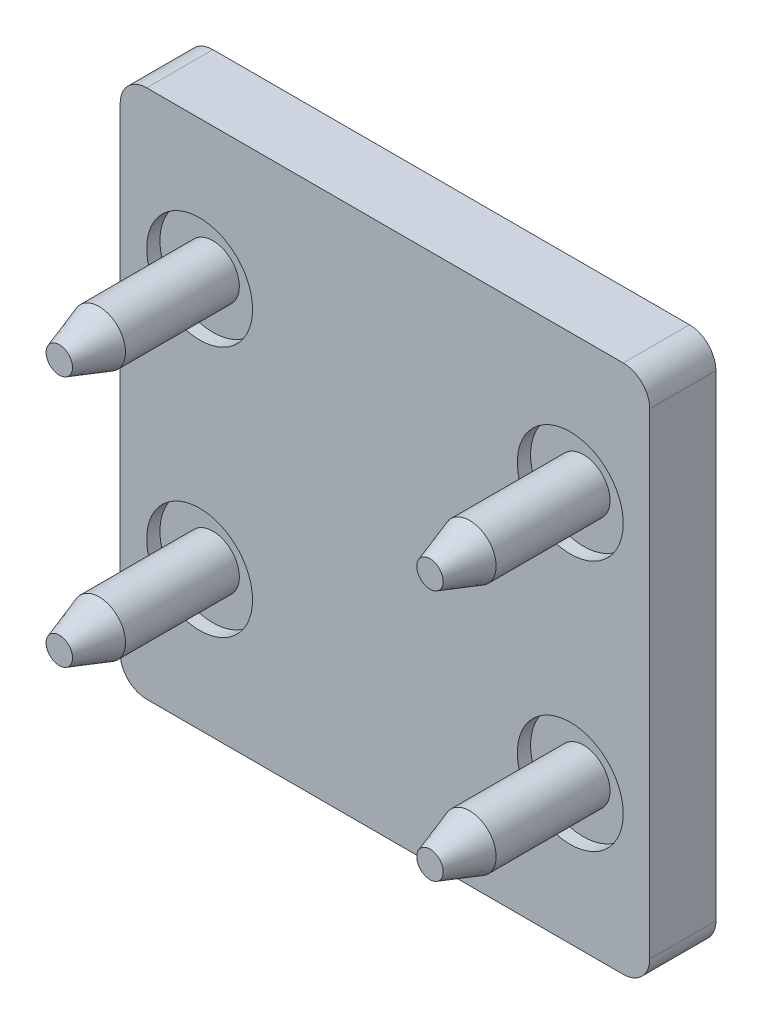
ISO-10303-21;
HEADER;
FILE_DESCRIPTION(('STEP AP214'),'2;1');
FILE_NAME('part.step','',(''),(''),'','','');
FILE_SCHEMA(('AUTOMOTIVE_DESIGN { 1 0 10303 214 1 1 1 1 }'));
ENDSEC;
DATA;
#1=APPLICATION_CONTEXT('core data for automotive mechanical design processes');
#2=APPLICATION_PROTOCOL_DEFINITION('international standard','automotive_design',2000,#1);
#3=PRODUCT_CONTEXT('',#1,'mechanical');
#4=PRODUCT('Part','Part','',(#3));
#5=PRODUCT_RELATED_PRODUCT_CATEGORY('part','',(#4));
#6=PRODUCT_DEFINITION_FORMATION('','',#4);
#7=PRODUCT_DEFINITION_CONTEXT('part definition',#1,'design');
#8=PRODUCT_DEFINITION('design','',#6,#7);
#9=PRODUCT_DEFINITION_SHAPE('','',#8);
#10=(LENGTH_UNIT() NAMED_UNIT(*) SI_UNIT(.MILLI.,.METRE.));
#11=(NAMED_UNIT(*) PLANE_ANGLE_UNIT() SI_UNIT($,.RADIAN.));
#12=(NAMED_UNIT(*) SI_UNIT($,.STERADIAN.) SOLID_ANGLE_UNIT());
#13=UNCERTAINTY_MEASURE_WITH_UNIT(LENGTH_MEASURE(1.E-05),#10,'distance_accuracy_value','');
#14=(GEOMETRIC_REPRESENTATION_CONTEXT(3) GLOBAL_UNCERTAINTY_ASSIGNED_CONTEXT((#13)) GLOBAL_UNIT_ASSIGNED_CONTEXT((#10,
#11,#12)) REPRESENTATION_CONTEXT('',''));
#15=CARTESIAN_POINT('',(0.,0.,0.));
#16=DIRECTION('',(0.,0.,1.));
#17=DIRECTION('',(1.,0.,0.));
#18=AXIS2_PLACEMENT_3D('',#15,#16,#17);
#19=CARTESIAN_POINT('',(-7.,-2.75,-0.5));
#20=DIRECTION('',(0.,0.,1.));
#21=DIRECTION('',(1.,0.,0.));
#22=AXIS2_PLACEMENT_3D('',#19,#20,#21);
#23=PLANE('',#22);
#24=CARTESIAN_POINT('',(-7.,-4.75,-0.5));
#25=DIRECTION('',(0.,0.,1.));
#26=DIRECTION('',(1.,0.,0.));
#27=AXIS2_PLACEMENT_3D('',#24,#25,#26);
#28=CIRCLE('',#27,2.);
#29=CARTESIAN_POINT('',(-5.,-4.75,-0.5));
#30=VERTEX_POINT('',#29);
#31=EDGE_CURVE('E516',#30,#30,#28,.T.);
#32=ORIENTED_EDGE('',*,*,#31,.T.);
#33=EDGE_LOOP('',(#32));
#34=FACE_BOUND('',#33,.T.);
#35=CARTESIAN_POINT('',(-7.,-4.75,-0.5));
#36=DIRECTION('',(0.,0.,1.));
#37=DIRECTION('',(1.,0.,0.));
#38=AXIS2_PLACEMENT_3D('',#35,#36,#37);
#39=CIRCLE('',#38,1.);
#40=CARTESIAN_POINT('',(-6.,-4.75,-0.5));
#41=VERTEX_POINT('',#40);
#42=EDGE_CURVE('E482',#41,#41,#39,.T.);
#43=ORIENTED_EDGE('',*,*,#42,.F.);
#44=EDGE_LOOP('',(#43));
#45=FACE_BOUND('',#44,.T.);
#46=ADVANCED_FACE('F34',(#34,#45),#23,.T.);
#47=CARTESIAN_POINT('',(7.,-2.75,-0.5));
#48=DIRECTION('',(0.,0.,1.));
#49=DIRECTION('',(1.,0.,0.));
#50=AXIS2_PLACEMENT_3D('',#47,#48,#49);
#51=PLANE('',#50);
#52=CARTESIAN_POINT('',(7.,-4.75,-0.5));
#53=DIRECTION('',(0.,0.,1.));
#54=DIRECTION('',(1.,0.,0.));
#55=AXIS2_PLACEMENT_3D('',#52,#53,#54);
#56=CIRCLE('',#55,2.);
#57=CARTESIAN_POINT('',(9.,-4.75,-0.5));
#58=VERTEX_POINT('',#57);
#59=EDGE_CURVE('E521',#58,#58,#56,.T.);
#60=ORIENTED_EDGE('',*,*,#59,.T.);
#61=EDGE_LOOP('',(#60));
#62=FACE_BOUND('',#61,.T.);
#63=CARTESIAN_POINT('',(7.,-4.75,-0.5));
#64=DIRECTION('',(0.,0.,1.));
#65=DIRECTION('',(1.,0.,0.));
#66=AXIS2_PLACEMENT_3D('',#63,#64,#65);
#67=CIRCLE('',#66,1.);
#68=CARTESIAN_POINT('',(8.,-4.75,-0.5));
#69=VERTEX_POINT('',#68);
#70=EDGE_CURVE('E489',#69,#69,#67,.T.);
#71=ORIENTED_EDGE('',*,*,#70,.F.);
#72=EDGE_LOOP('',(#71));
#73=FACE_BOUND('',#72,.T.);
#74=ADVANCED_FACE('F176',(#62,#73),#51,.T.);
#75=CARTESIAN_POINT('',(7.,6.75,-0.5));
#76=DIRECTION('',(0.,0.,1.));
#77=DIRECTION('',(1.,0.,0.));
#78=AXIS2_PLACEMENT_3D('',#75,#76,#77);
#79=PLANE('',#78);
#80=CARTESIAN_POINT('',(7.,4.75,-0.5));
#81=DIRECTION('',(0.,0.,1.));
#82=DIRECTION('',(1.,0.,0.));
#83=AXIS2_PLACEMENT_3D('',#80,#81,#82);
#84=CIRCLE('',#83,2.);
#85=CARTESIAN_POINT('',(9.,4.75,-0.5));
#86=VERTEX_POINT('',#85);
#87=EDGE_CURVE('E525',#86,#86,#84,.T.);
#88=ORIENTED_EDGE('',*,*,#87,.T.);
#89=EDGE_LOOP('',(#88));
#90=FACE_BOUND('',#89,.T.);
#91=CARTESIAN_POINT('',(7.,4.75,-0.5));
#92=DIRECTION('',(0.,0.,1.));
#93=DIRECTION('',(1.,0.,0.));
#94=AXIS2_PLACEMENT_3D('',#91,#92,#93);
#95=CIRCLE('',#94,1.);
#96=CARTESIAN_POINT('',(8.,4.75,-0.5));
#97=VERTEX_POINT('',#96);
#98=EDGE_CURVE('E498',#97,#97,#95,.T.);
#99=ORIENTED_EDGE('',*,*,#98,.F.);
#100=EDGE_LOOP('',(#99));
#101=FACE_BOUND('',#100,.T.);
#102=ADVANCED_FACE('F182',(#90,#101),#79,.T.);
#103=CARTESIAN_POINT('',(-7.,6.75,-0.5));
#104=DIRECTION('',(0.,0.,1.));
#105=DIRECTION('',(1.,0.,0.));
#106=AXIS2_PLACEMENT_3D('',#103,#104,#105);
#107=PLANE('',#106);
#108=CARTESIAN_POINT('',(-7.,4.75,-0.5));
#109=DIRECTION('',(0.,0.,1.));
#110=DIRECTION('',(1.,0.,0.));
#111=AXIS2_PLACEMENT_3D('',#108,#109,#110);
#112=CIRCLE('',#111,2.);
#113=CARTESIAN_POINT('',(-5.,4.75,-0.5));
#114=VERTEX_POINT('',#113);
#115=EDGE_CURVE('E225',#114,#114,#112,.T.);
#116=ORIENTED_EDGE('',*,*,#115,.T.);
#117=EDGE_LOOP('',(#116));
#118=FACE_BOUND('',#117,.T.);
#119=CARTESIAN_POINT('',(-7.,4.75,-0.5));
#120=DIRECTION('',(0.,0.,1.));
#121=DIRECTION('',(1.,0.,0.));
#122=AXIS2_PLACEMENT_3D('',#119,#120,#121);
#123=CIRCLE('',#122,1.);
#124=CARTESIAN_POINT('',(-6.,4.75,-0.5));
#125=VERTEX_POINT('',#124);
#126=EDGE_CURVE('E507',#125,#125,#123,.T.);
#127=ORIENTED_EDGE('',*,*,#126,.F.);
#128=EDGE_LOOP('',(#127));
#129=FACE_BOUND('',#128,.T.);
#130=ADVANCED_FACE('F202',(#118,#129),#107,.T.);
#131=CARTESIAN_POINT('',(-8.99999999999983,8.99999999999983,0.));
#132=DIRECTION('',(0.,0.,1.));
#133=DIRECTION('',(1.,0.,0.));
#134=AXIS2_PLACEMENT_3D('',#131,#132,#133);
#135=PLANE('',#134);
#136=CARTESIAN_POINT('',(7.,-4.75,0.));
#137=DIRECTION('',(0.,0.,1.));
#138=DIRECTION('',(1.,0.,0.));
#139=AXIS2_PLACEMENT_3D('',#136,#137,#138);
#140=CIRCLE('',#139,2.);
#141=CARTESIAN_POINT('',(9.,-4.75,0.));
#142=VERTEX_POINT('',#141);
#143=EDGE_CURVE('E222',#142,#142,#140,.T.);
#144=ORIENTED_EDGE('',*,*,#143,.F.);
#145=EDGE_LOOP('',(#144));
#146=FACE_BOUND('',#145,.T.);
#147=CARTESIAN_POINT('',(-7.,4.75,0.));
#148=DIRECTION('',(0.,0.,1.));
#149=DIRECTION('',(1.,0.,0.));
#150=AXIS2_PLACEMENT_3D('',#147,#148,#149);
#151=CIRCLE('',#150,2.);
#152=CARTESIAN_POINT('',(-5.,4.75,0.));
#153=VERTEX_POINT('',#152);
#154=EDGE_CURVE('E136',#153,#153,#151,.T.);
#155=ORIENTED_EDGE('',*,*,#154,.F.);
#156=EDGE_LOOP('',(#155));
#157=FACE_BOUND('',#156,.T.);
#158=CARTESIAN_POINT('',(-8.99999999999983,8.99999999999983,0.));
#159=DIRECTION('',(0.,0.,1.));
#160=DIRECTION('',(1.,0.,0.));
#161=AXIS2_PLACEMENT_3D('',#158,#159,#160);
#162=CIRCLE('',#161,1.00000000000017);
#163=CARTESIAN_POINT('',(-9.,10.,0.));
#164=VERTEX_POINT('',#163);
#165=CARTESIAN_POINT('',(-10.,9.,0.));
#166=VERTEX_POINT('',#165);
#167=EDGE_CURVE('E132',#164,#166,#162,.T.);
#168=ORIENTED_EDGE('',*,*,#167,.T.);
#169=DIRECTION('',(0.,-1.,0.));
#170=VECTOR('',#169,1.);
#171=CARTESIAN_POINT('',(-10.,9.,0.));
#172=LINE('',#171,#170);
#173=CARTESIAN_POINT('',(-10.,-9.,0.));
#174=VERTEX_POINT('',#173);
#175=EDGE_CURVE('E135',#166,#174,#172,.T.);
#176=ORIENTED_EDGE('',*,*,#175,.T.);
#177=CARTESIAN_POINT('',(-8.99999999999983,-8.99999999999983,0.));
#178=DIRECTION('',(0.,0.,1.));
#179=DIRECTION('',(1.,0.,0.));
#180=AXIS2_PLACEMENT_3D('',#177,#178,#179);
#181=CIRCLE('',#180,1.00000000000017);
#182=CARTESIAN_POINT('',(-9.,-10.,0.));
#183=VERTEX_POINT('',#182);
#184=EDGE_CURVE('E139',#174,#183,#181,.T.);
#185=ORIENTED_EDGE('',*,*,#184,.T.);
#186=DIRECTION('',(1.,0.,0.));
#187=VECTOR('',#186,1.);
#188=CARTESIAN_POINT('',(-9.,-10.,0.));
#189=LINE('',#188,#187);
#190=CARTESIAN_POINT('',(9.,-10.,0.));
#191=VERTEX_POINT('',#190);
#192=EDGE_CURVE('E142',#183,#191,#189,.T.);
#193=ORIENTED_EDGE('',*,*,#192,.T.);
#194=CARTESIAN_POINT('',(8.99999999999983,-8.99999999999983,0.));
#195=DIRECTION('',(0.,0.,1.));
#196=DIRECTION('',(1.,0.,0.));
#197=AXIS2_PLACEMENT_3D('',#194,#195,#196);
#198=CIRCLE('',#197,1.00000000000017);
#199=CARTESIAN_POINT('',(10.,-9.,0.));
#200=VERTEX_POINT('',#199);
#201=EDGE_CURVE('E145',#191,#200,#198,.T.);
#202=ORIENTED_EDGE('',*,*,#201,.T.);
#203=DIRECTION('',(0.,1.,0.));
#204=VECTOR('',#203,1.);
#205=CARTESIAN_POINT('',(10.,-9.,0.));
#206=LINE('',#205,#204);
#207=CARTESIAN_POINT('',(10.,9.,0.));
#208=VERTEX_POINT('',#207);
#209=EDGE_CURVE('E148',#200,#208,#206,.T.);
#210=ORIENTED_EDGE('',*,*,#209,.T.);
#211=CARTESIAN_POINT('',(8.99999999999983,8.99999999999983,0.));
#212=DIRECTION('',(0.,0.,1.));
#213=DIRECTION('',(1.,0.,0.));
#214=AXIS2_PLACEMENT_3D('',#211,#212,#213);
#215=CIRCLE('',#214,1.00000000000017);
#216=CARTESIAN_POINT('',(9.,10.,0.));
#217=VERTEX_POINT('',#216);
#218=EDGE_CURVE('E109',#208,#217,#215,.T.);
#219=ORIENTED_EDGE('',*,*,#218,.T.);
#220=DIRECTION('',(-1.,0.,0.));
#221=VECTOR('',#220,1.);
#222=CARTESIAN_POINT('',(9.,10.,0.));
#223=LINE('',#222,#221);
#224=EDGE_CURVE('E151',#217,#164,#223,.T.);
#225=ORIENTED_EDGE('',*,*,#224,.T.);
#226=EDGE_LOOP('',(#168,#176,#185,#193,#202,#210,#219,#225));
#227=FACE_BOUND('',#226,.T.);
#228=CARTESIAN_POINT('',(7.,4.75,0.));
#229=DIRECTION('',(0.,0.,1.));
#230=DIRECTION('',(1.,0.,0.));
#231=AXIS2_PLACEMENT_3D('',#228,#229,#230);
#232=CIRCLE('',#231,2.);
#233=CARTESIAN_POINT('',(9.,4.75,0.));
#234=VERTEX_POINT('',#233);
#235=EDGE_CURVE('E228',#234,#234,#232,.T.);
#236=ORIENTED_EDGE('',*,*,#235,.F.);
#237=EDGE_LOOP('',(#236));
#238=FACE_BOUND('',#237,.T.);
#239=CARTESIAN_POINT('',(-7.,-4.75,0.));
#240=DIRECTION('',(0.,0.,1.));
#241=DIRECTION('',(1.,0.,0.));
#242=AXIS2_PLACEMENT_3D('',#239,#240,#241);
#243=CIRCLE('',#242,2.);
#244=CARTESIAN_POINT('',(-5.,-4.75,0.));
#245=VERTEX_POINT('',#244);
#246=EDGE_CURVE('E518',#245,#245,#243,.T.);
#247=ORIENTED_EDGE('',*,*,#246,.F.);
#248=EDGE_LOOP('',(#247));
#249=FACE_BOUND('',#248,.T.);
#250=ADVANCED_FACE('F164',(#146,#157,#227,#238,#249),#135,.T.);
#251=CARTESIAN_POINT('',(-8.99999999999983,8.99999999999983,-2.5));
#252=DIRECTION('',(0.,0.,1.));
#253=DIRECTION('',(1.,0.,0.));
#254=AXIS2_PLACEMENT_3D('',#251,#252,#253);
#255=CYLINDRICAL_SURFACE('',#254,1.00000000000017);
#256=ORIENTED_EDGE('',*,*,#167,.F.);
#257=DIRECTION('',(0.,0.,1.));
#258=VECTOR('',#257,1.);
#259=CARTESIAN_POINT('',(-9.,10.,-2.5));
#260=LINE('',#259,#258);
#261=CARTESIAN_POINT('',(-9.,10.,-2.5));
#262=VERTEX_POINT('',#261);
#263=EDGE_CURVE('E11',#262,#164,#260,.T.);
#264=ORIENTED_EDGE('',*,*,#263,.F.);
#265=CARTESIAN_POINT('',(-8.99999999999983,8.99999999999983,-2.5));
#266=DIRECTION('',(0.,0.,1.));
#267=DIRECTION('',(1.,0.,0.));
#268=AXIS2_PLACEMENT_3D('',#265,#266,#267);
#269=CIRCLE('',#268,1.00000000000017);
#270=CARTESIAN_POINT('',(-10.,9.,-2.5));
#271=VERTEX_POINT('',#270);
#272=EDGE_CURVE('E153',#262,#271,#269,.T.);
#273=ORIENTED_EDGE('',*,*,#272,.T.);
#274=DIRECTION('',(0.,0.,1.));
#275=VECTOR('',#274,1.);
#276=CARTESIAN_POINT('',(-10.,9.,-2.5));
#277=LINE('',#276,#275);
#278=EDGE_CURVE('E38',#271,#166,#277,.T.);
#279=ORIENTED_EDGE('',*,*,#278,.T.);
#280=EDGE_LOOP('',(#256,#264,#273,#279));
#281=FACE_BOUND('',#280,.T.);
#282=ADVANCED_FACE('F36',(#281),#255,.T.);
#283=CARTESIAN_POINT('',(9.,10.,-2.5));
#284=DIRECTION('',(0.,1.,0.));
#285=DIRECTION('',(0.,0.,1.));
#286=AXIS2_PLACEMENT_3D('',#283,#284,#285);
#287=PLANE('',#286);
#288=ORIENTED_EDGE('',*,*,#224,.F.);
#289=DIRECTION('',(0.,0.,1.));
#290=VECTOR('',#289,1.);
#291=CARTESIAN_POINT('',(9.,10.,-2.5));
#292=LINE('',#291,#290);
#293=CARTESIAN_POINT('',(9.,10.,-2.5));
#294=VERTEX_POINT('',#293);
#295=EDGE_CURVE('E44',#294,#217,#292,.T.);
#296=ORIENTED_EDGE('',*,*,#295,.F.);
#297=DIRECTION('',(-1.,0.,0.));
#298=VECTOR('',#297,1.);
#299=CARTESIAN_POINT('',(9.,10.,-2.5));
#300=LINE('',#299,#298);
#301=EDGE_CURVE('E122',#294,#262,#300,.T.);
#302=ORIENTED_EDGE('',*,*,#301,.T.);
#303=ORIENTED_EDGE('',*,*,#263,.T.);
#304=EDGE_LOOP('',(#288,#296,#302,#303));
#305=FACE_BOUND('',#304,.T.);
#306=ADVANCED_FACE('F166',(#305),#287,.T.);
#307=CARTESIAN_POINT('',(8.99999999999983,8.99999999999983,-2.5));
#308=DIRECTION('',(0.,0.,1.));
#309=DIRECTION('',(1.,0.,0.));
#310=AXIS2_PLACEMENT_3D('',#307,#308,#309);
#311=CYLINDRICAL_SURFACE('',#310,1.00000000000017);
#312=ORIENTED_EDGE('',*,*,#218,.F.);
#313=DIRECTION('',(0.,0.,1.));
#314=VECTOR('',#313,1.);
#315=CARTESIAN_POINT('',(10.,9.,-2.5));
#316=LINE('',#315,#314);
#317=CARTESIAN_POINT('',(10.,9.,-2.5));
#318=VERTEX_POINT('',#317);
#319=EDGE_CURVE('E104',#318,#208,#316,.T.);
#320=ORIENTED_EDGE('',*,*,#319,.F.);
#321=CARTESIAN_POINT('',(8.99999999999983,8.99999999999983,-2.5));
#322=DIRECTION('',(0.,0.,1.));
#323=DIRECTION('',(1.,0.,0.));
#324=AXIS2_PLACEMENT_3D('',#321,#322,#323);
#325=CIRCLE('',#324,1.00000000000017);
#326=EDGE_CURVE('E107',#318,#294,#325,.T.);
#327=ORIENTED_EDGE('',*,*,#326,.T.);
#328=ORIENTED_EDGE('',*,*,#295,.T.);
#329=EDGE_LOOP('',(#312,#320,#327,#328));
#330=FACE_BOUND('',#329,.T.);
#331=ADVANCED_FACE('F106',(#330),#311,.T.);
#332=CARTESIAN_POINT('',(10.,-9.,-2.5));
#333=DIRECTION('',(1.,0.,0.));
#334=DIRECTION('',(0.,0.,-1.));
#335=AXIS2_PLACEMENT_3D('',#332,#333,#334);
#336=PLANE('',#335);
#337=ORIENTED_EDGE('',*,*,#209,.F.);
#338=DIRECTION('',(0.,0.,1.));
#339=VECTOR('',#338,1.);
#340=CARTESIAN_POINT('',(10.,-9.,-2.5));
#341=LINE('',#340,#339);
#342=CARTESIAN_POINT('',(10.,-9.,-2.5));
#343=VERTEX_POINT('',#342);
#344=EDGE_CURVE('E114',#343,#200,#341,.T.);
#345=ORIENTED_EDGE('',*,*,#344,.F.);
#346=DIRECTION('',(0.,1.,0.));
#347=VECTOR('',#346,1.);
#348=CARTESIAN_POINT('',(10.,-9.,-2.5));
#349=LINE('',#348,#347);
#350=EDGE_CURVE('E120',#343,#318,#349,.T.);
#351=ORIENTED_EDGE('',*,*,#350,.T.);
#352=ORIENTED_EDGE('',*,*,#319,.T.);
#353=EDGE_LOOP('',(#337,#345,#351,#352));
#354=FACE_BOUND('',#353,.T.);
#355=ADVANCED_FACE('F124',(#354),#336,.T.);
#356=CARTESIAN_POINT('',(8.99999999999983,-8.99999999999983,-2.5));
#357=DIRECTION('',(0.,0.,1.));
#358=DIRECTION('',(1.,0.,0.));
#359=AXIS2_PLACEMENT_3D('',#356,#357,#358);
#360=CYLINDRICAL_SURFACE('',#359,1.00000000000017);
#361=ORIENTED_EDGE('',*,*,#201,.F.);
#362=DIRECTION('',(0.,0.,1.));
#363=VECTOR('',#362,1.);
#364=CARTESIAN_POINT('',(9.,-10.,-2.5));
#365=LINE('',#364,#363);
#366=CARTESIAN_POINT('',(9.,-10.,-2.5));
#367=VERTEX_POINT('',#366);
#368=EDGE_CURVE('E157',#367,#191,#365,.T.);
#369=ORIENTED_EDGE('',*,*,#368,.F.);
#370=CARTESIAN_POINT('',(8.99999999999983,-8.99999999999983,-2.5));
#371=DIRECTION('',(0.,0.,1.));
#372=DIRECTION('',(1.,0.,0.));
#373=AXIS2_PLACEMENT_3D('',#370,#371,#372);
#374=CIRCLE('',#373,1.00000000000017);
#375=EDGE_CURVE('E125',#367,#343,#374,.T.);
#376=ORIENTED_EDGE('',*,*,#375,.T.);
#377=ORIENTED_EDGE('',*,*,#344,.T.);
#378=EDGE_LOOP('',(#361,#369,#376,#377));
#379=FACE_BOUND('',#378,.T.);
#380=ADVANCED_FACE('F247',(#379),#360,.T.);
#381=CARTESIAN_POINT('',(-9.,-10.,-2.5));
#382=DIRECTION('',(0.,-1.,0.));
#383=DIRECTION('',(0.,0.,-1.));
#384=AXIS2_PLACEMENT_3D('',#381,#382,#383);
#385=PLANE('',#384);
#386=ORIENTED_EDGE('',*,*,#192,.F.);
#387=DIRECTION('',(0.,0.,1.));
#388=VECTOR('',#387,1.);
#389=CARTESIAN_POINT('',(-9.,-10.,-2.5));
#390=LINE('',#389,#388);
#391=CARTESIAN_POINT('',(-9.,-10.,-2.5));
#392=VERTEX_POINT('',#391);
#393=EDGE_CURVE('E159',#392,#183,#390,.T.);
#394=ORIENTED_EDGE('',*,*,#393,.F.);
#395=DIRECTION('',(1.,0.,0.));
#396=VECTOR('',#395,1.);
#397=CARTESIAN_POINT('',(-9.,-10.,-2.5));
#398=LINE('',#397,#396);
#399=EDGE_CURVE('E127',#392,#367,#398,.T.);
#400=ORIENTED_EDGE('',*,*,#399,.T.);
#401=ORIENTED_EDGE('',*,*,#368,.T.);
#402=EDGE_LOOP('',(#386,#394,#400,#401));
#403=FACE_BOUND('',#402,.T.);
#404=ADVANCED_FACE('F241',(#403),#385,.T.);
#405=CARTESIAN_POINT('',(-8.99999999999983,-8.99999999999983,-2.5));
#406=DIRECTION('',(0.,0.,1.));
#407=DIRECTION('',(1.,0.,0.));
#408=AXIS2_PLACEMENT_3D('',#405,#406,#407);
#409=CYLINDRICAL_SURFACE('',#408,1.00000000000017);
#410=ORIENTED_EDGE('',*,*,#184,.F.);
#411=DIRECTION('',(0.,0.,1.));
#412=VECTOR('',#411,1.);
#413=CARTESIAN_POINT('',(-10.,-9.,-2.5));
#414=LINE('',#413,#412);
#415=CARTESIAN_POINT('',(-10.,-9.,-2.5));
#416=VERTEX_POINT('',#415);
#417=EDGE_CURVE('E160',#416,#174,#414,.T.);
#418=ORIENTED_EDGE('',*,*,#417,.F.);
#419=CARTESIAN_POINT('',(-8.99999999999983,-8.99999999999983,-2.5));
#420=DIRECTION('',(0.,0.,1.));
#421=DIRECTION('',(1.,0.,0.));
#422=AXIS2_PLACEMENT_3D('',#419,#420,#421);
#423=CIRCLE('',#422,1.00000000000017);
#424=EDGE_CURVE('E235',#416,#392,#423,.T.);
#425=ORIENTED_EDGE('',*,*,#424,.T.);
#426=ORIENTED_EDGE('',*,*,#393,.T.);
#427=EDGE_LOOP('',(#410,#418,#425,#426));
#428=FACE_BOUND('',#427,.T.);
#429=ADVANCED_FACE('F245',(#428),#409,.T.);
#430=CARTESIAN_POINT('',(-10.,9.,-2.5));
#431=DIRECTION('',(-1.,0.,0.));
#432=DIRECTION('',(0.,0.,1.));
#433=AXIS2_PLACEMENT_3D('',#430,#431,#432);
#434=PLANE('',#433);
#435=ORIENTED_EDGE('',*,*,#175,.F.);
#436=ORIENTED_EDGE('',*,*,#278,.F.);
#437=DIRECTION('',(0.,-1.,0.));
#438=VECTOR('',#437,1.);
#439=CARTESIAN_POINT('',(-10.,9.,-2.5));
#440=LINE('',#439,#438);
#441=EDGE_CURVE('E233',#271,#416,#440,.T.);
#442=ORIENTED_EDGE('',*,*,#441,.T.);
#443=ORIENTED_EDGE('',*,*,#417,.T.);
#444=EDGE_LOOP('',(#435,#436,#442,#443));
#445=FACE_BOUND('',#444,.T.);
#446=ADVANCED_FACE('F162',(#445),#434,.T.);
#447=CARTESIAN_POINT('',(-8.99999999999983,8.99999999999983,-2.5));
#448=DIRECTION('',(0.,0.,1.));
#449=DIRECTION('',(1.,0.,0.));
#450=AXIS2_PLACEMENT_3D('',#447,#448,#449);
#451=PLANE('',#450);
#452=ORIENTED_EDGE('',*,*,#272,.F.);
#453=ORIENTED_EDGE('',*,*,#301,.F.);
#454=ORIENTED_EDGE('',*,*,#326,.F.);
#455=ORIENTED_EDGE('',*,*,#350,.F.);
#456=ORIENTED_EDGE('',*,*,#375,.F.);
#457=ORIENTED_EDGE('',*,*,#399,.F.);
#458=ORIENTED_EDGE('',*,*,#424,.F.);
#459=ORIENTED_EDGE('',*,*,#441,.F.);
#460=EDGE_LOOP('',(#452,#453,#454,#455,#456,#457,#458,#459));
#461=FACE_BOUND('',#460,.T.);
#462=ADVANCED_FACE('F118',(#461),#451,.F.);
#463=CARTESIAN_POINT('',(-7.,4.75,-0.5));
#464=DIRECTION('',(0.,0.,1.));
#465=DIRECTION('',(1.,0.,0.));
#466=AXIS2_PLACEMENT_3D('',#463,#464,#465);
#467=CYLINDRICAL_SURFACE('',#466,2.);
#468=ORIENTED_EDGE('',*,*,#154,.T.);
#469=EDGE_LOOP('',(#468));
#470=FACE_BOUND('',#469,.T.);
#471=ORIENTED_EDGE('',*,*,#115,.F.);
#472=EDGE_LOOP('',(#471));
#473=FACE_BOUND('',#472,.T.);
#474=ADVANCED_FACE('F206',(#470,#473),#467,.F.);
#475=CARTESIAN_POINT('',(7.,4.75,-0.5));
#476=DIRECTION('',(0.,0.,1.));
#477=DIRECTION('',(1.,0.,0.));
#478=AXIS2_PLACEMENT_3D('',#475,#476,#477);
#479=CYLINDRICAL_SURFACE('',#478,2.);
#480=ORIENTED_EDGE('',*,*,#235,.T.);
#481=EDGE_LOOP('',(#480));
#482=FACE_BOUND('',#481,.T.);
#483=ORIENTED_EDGE('',*,*,#87,.F.);
#484=EDGE_LOOP('',(#483));
#485=FACE_BOUND('',#484,.T.);
#486=ADVANCED_FACE('F198',(#482,#485),#479,.F.);
#487=CARTESIAN_POINT('',(7.,-4.75,-0.5));
#488=DIRECTION('',(0.,0.,1.));
#489=DIRECTION('',(1.,0.,0.));
#490=AXIS2_PLACEMENT_3D('',#487,#488,#489);
#491=CYLINDRICAL_SURFACE('',#490,2.);
#492=ORIENTED_EDGE('',*,*,#143,.T.);
#493=EDGE_LOOP('',(#492));
#494=FACE_BOUND('',#493,.T.);
#495=ORIENTED_EDGE('',*,*,#59,.F.);
#496=EDGE_LOOP('',(#495));
#497=FACE_BOUND('',#496,.T.);
#498=ADVANCED_FACE('F193',(#494,#497),#491,.F.);
#499=CARTESIAN_POINT('',(-7.,-4.75,-0.5));
#500=DIRECTION('',(0.,0.,1.));
#501=DIRECTION('',(1.,0.,0.));
#502=AXIS2_PLACEMENT_3D('',#499,#500,#501);
#503=CYLINDRICAL_SURFACE('',#502,2.);
#504=ORIENTED_EDGE('',*,*,#246,.T.);
#505=EDGE_LOOP('',(#504));
#506=FACE_BOUND('',#505,.T.);
#507=ORIENTED_EDGE('',*,*,#31,.F.);
#508=EDGE_LOOP('',(#507));
#509=FACE_BOUND('',#508,.T.);
#510=ADVANCED_FACE('F191',(#506,#509),#503,.F.);
#511=CARTESIAN_POINT('',(-7.,4.75,5.3));
#512=DIRECTION('',(0.,0.,-1.));
#513=DIRECTION('',(-1.,0.,0.));
#514=AXIS2_PLACEMENT_3D('',#511,#512,#513);
#515=PLANE('',#514);
#516=CARTESIAN_POINT('',(-7.,4.75,5.3));
#517=DIRECTION('',(0.,0.,1.));
#518=DIRECTION('',(1.,0.,0.));
#519=AXIS2_PLACEMENT_3D('',#516,#517,#518);
#520=CIRCLE('',#519,0.5);
#521=CARTESIAN_POINT('',(-6.5,4.75,5.3));
#522=VERTEX_POINT('',#521);
#523=EDGE_CURVE('E513',#522,#522,#520,.T.);
#524=ORIENTED_EDGE('',*,*,#523,.T.);
#525=EDGE_LOOP('',(#524));
#526=FACE_BOUND('',#525,.T.);
#527=ADVANCED_FACE('F189',(#526),#515,.F.);
#528=CARTESIAN_POINT('',(-7.,4.75,3.8));
#529=DIRECTION('',(0.,0.,-1.));
#530=DIRECTION('',(-1.,0.,0.));
#531=AXIS2_PLACEMENT_3D('',#528,#529,#530);
#532=CONICAL_SURFACE('',#531,1.,0.321750554396642);
#533=ORIENTED_EDGE('',*,*,#523,.F.);
#534=EDGE_LOOP('',(#533));
#535=FACE_BOUND('',#534,.T.);
#536=CARTESIAN_POINT('',(-7.,4.75,3.8));
#537=DIRECTION('',(0.,0.,1.));
#538=DIRECTION('',(1.,0.,0.));
#539=AXIS2_PLACEMENT_3D('',#536,#537,#538);
#540=CIRCLE('',#539,1.);
#541=CARTESIAN_POINT('',(-6.,4.75,3.8));
#542=VERTEX_POINT('',#541);
#543=EDGE_CURVE('E510',#542,#542,#540,.T.);
#544=ORIENTED_EDGE('',*,*,#543,.T.);
#545=EDGE_LOOP('',(#544));
#546=FACE_BOUND('',#545,.T.);
#547=ADVANCED_FACE('F290',(#535,#546),#532,.T.);
#548=CARTESIAN_POINT('',(-7.,4.75,-0.5));
#549=DIRECTION('',(0.,0.,1.));
#550=DIRECTION('',(1.,0.,0.));
#551=AXIS2_PLACEMENT_3D('',#548,#549,#550);
#552=CYLINDRICAL_SURFACE('',#551,1.);
#553=ORIENTED_EDGE('',*,*,#543,.F.);
#554=EDGE_LOOP('',(#553));
#555=FACE_BOUND('',#554,.T.);
#556=ORIENTED_EDGE('',*,*,#126,.T.);
#557=EDGE_LOOP('',(#556));
#558=FACE_BOUND('',#557,.T.);
#559=ADVANCED_FACE('F297',(#555,#558),#552,.T.);
#560=CARTESIAN_POINT('',(7.,4.75,5.3));
#561=DIRECTION('',(0.,0.,-1.));
#562=DIRECTION('',(-1.,0.,0.));
#563=AXIS2_PLACEMENT_3D('',#560,#561,#562);
#564=PLANE('',#563);
#565=CARTESIAN_POINT('',(7.,4.75,5.3));
#566=DIRECTION('',(0.,0.,1.));
#567=DIRECTION('',(1.,0.,0.));
#568=AXIS2_PLACEMENT_3D('',#565,#566,#567);
#569=CIRCLE('',#568,0.5);
#570=CARTESIAN_POINT('',(7.5,4.75,5.3));
#571=VERTEX_POINT('',#570);
#572=EDGE_CURVE('E504',#571,#571,#569,.T.);
#573=ORIENTED_EDGE('',*,*,#572,.T.);
#574=EDGE_LOOP('',(#573));
#575=FACE_BOUND('',#574,.T.);
#576=ADVANCED_FACE('F304',(#575),#564,.F.);
#577=CARTESIAN_POINT('',(7.,4.75,3.8));
#578=DIRECTION('',(0.,0.,-1.));
#579=DIRECTION('',(-1.,0.,0.));
#580=AXIS2_PLACEMENT_3D('',#577,#578,#579);
#581=CONICAL_SURFACE('',#580,1.,0.321750554396642);
#582=ORIENTED_EDGE('',*,*,#572,.F.);
#583=EDGE_LOOP('',(#582));
#584=FACE_BOUND('',#583,.T.);
#585=CARTESIAN_POINT('',(7.,4.75,3.8));
#586=DIRECTION('',(0.,0.,1.));
#587=DIRECTION('',(1.,0.,0.));
#588=AXIS2_PLACEMENT_3D('',#585,#586,#587);
#589=CIRCLE('',#588,1.);
#590=CARTESIAN_POINT('',(8.,4.75,3.8));
#591=VERTEX_POINT('',#590);
#592=EDGE_CURVE('E501',#591,#591,#589,.T.);
#593=ORIENTED_EDGE('',*,*,#592,.T.);
#594=EDGE_LOOP('',(#593));
#595=FACE_BOUND('',#594,.T.);
#596=ADVANCED_FACE('F313',(#584,#595),#581,.T.);
#597=CARTESIAN_POINT('',(7.,4.75,-0.5));
#598=DIRECTION('',(0.,0.,1.));
#599=DIRECTION('',(1.,0.,0.));
#600=AXIS2_PLACEMENT_3D('',#597,#598,#599);
#601=CYLINDRICAL_SURFACE('',#600,1.);
#602=ORIENTED_EDGE('',*,*,#592,.F.);
#603=EDGE_LOOP('',(#602));
#604=FACE_BOUND('',#603,.T.);
#605=ORIENTED_EDGE('',*,*,#98,.T.);
#606=EDGE_LOOP('',(#605));
#607=FACE_BOUND('',#606,.T.);
#608=ADVANCED_FACE('F321',(#604,#607),#601,.T.);
#609=CARTESIAN_POINT('',(7.,-4.75,5.3));
#610=DIRECTION('',(0.,0.,-1.));
#611=DIRECTION('',(-1.,0.,0.));
#612=AXIS2_PLACEMENT_3D('',#609,#610,#611);
#613=PLANE('',#612);
#614=CARTESIAN_POINT('',(7.,-4.75,5.3));
#615=DIRECTION('',(0.,0.,1.));
#616=DIRECTION('',(1.,0.,0.));
#617=AXIS2_PLACEMENT_3D('',#614,#615,#616);
#618=CIRCLE('',#617,0.5);
#619=CARTESIAN_POINT('',(7.5,-4.75,5.3));
#620=VERTEX_POINT('',#619);
#621=EDGE_CURVE('E495',#620,#620,#618,.T.);
#622=ORIENTED_EDGE('',*,*,#621,.T.);
#623=EDGE_LOOP('',(#622));
#624=FACE_BOUND('',#623,.T.);
#625=ADVANCED_FACE('F329',(#624),#613,.F.);
#626=CARTESIAN_POINT('',(7.,-4.75,3.8));
#627=DIRECTION('',(0.,0.,-1.));
#628=DIRECTION('',(-1.,0.,0.));
#629=AXIS2_PLACEMENT_3D('',#626,#627,#628);
#630=CONICAL_SURFACE('',#629,1.,0.321750554396642);
#631=ORIENTED_EDGE('',*,*,#621,.F.);
#632=EDGE_LOOP('',(#631));
#633=FACE_BOUND('',#632,.T.);
#634=CARTESIAN_POINT('',(7.,-4.75,3.8));
#635=DIRECTION('',(0.,0.,1.));
#636=DIRECTION('',(1.,0.,0.));
#637=AXIS2_PLACEMENT_3D('',#634,#635,#636);
#638=CIRCLE('',#637,1.);
#639=CARTESIAN_POINT('',(8.,-4.75,3.8));
#640=VERTEX_POINT('',#639);
#641=EDGE_CURVE('E492',#640,#640,#638,.T.);
#642=ORIENTED_EDGE('',*,*,#641,.T.);
#643=EDGE_LOOP('',(#642));
#644=FACE_BOUND('',#643,.T.);
#645=ADVANCED_FACE('F338',(#633,#644),#630,.T.);
#646=CARTESIAN_POINT('',(7.,-4.75,-0.5));
#647=DIRECTION('',(0.,0.,1.));
#648=DIRECTION('',(1.,0.,0.));
#649=AXIS2_PLACEMENT_3D('',#646,#647,#648);
#650=CYLINDRICAL_SURFACE('',#649,1.);
#651=ORIENTED_EDGE('',*,*,#641,.F.);
#652=EDGE_LOOP('',(#651));
#653=FACE_BOUND('',#652,.T.);
#654=ORIENTED_EDGE('',*,*,#70,.T.);
#655=EDGE_LOOP('',(#654));
#656=FACE_BOUND('',#655,.T.);
#657=ADVANCED_FACE('F346',(#653,#656),#650,.T.);
#658=CARTESIAN_POINT('',(-7.,-4.75,5.3));
#659=DIRECTION('',(0.,0.,-1.));
#660=DIRECTION('',(-1.,0.,0.));
#661=AXIS2_PLACEMENT_3D('',#658,#659,#660);
#662=PLANE('',#661);
#663=CARTESIAN_POINT('',(-7.,-4.75,5.3));
#664=DIRECTION('',(0.,0.,1.));
#665=DIRECTION('',(1.,0.,0.));
#666=AXIS2_PLACEMENT_3D('',#663,#664,#665);
#667=CIRCLE('',#666,0.5);
#668=CARTESIAN_POINT('',(-6.5,-4.75,5.3));
#669=VERTEX_POINT('',#668);
#670=EDGE_CURVE('E484',#669,#669,#667,.T.);
#671=ORIENTED_EDGE('',*,*,#670,.T.);
#672=EDGE_LOOP('',(#671));
#673=FACE_BOUND('',#672,.T.);
#674=ADVANCED_FACE('F354',(#673),#662,.F.);
#675=CARTESIAN_POINT('',(-7.,-4.75,3.8));
#676=DIRECTION('',(0.,0.,-1.));
#677=DIRECTION('',(-1.,0.,0.));
#678=AXIS2_PLACEMENT_3D('',#675,#676,#677);
#679=CONICAL_SURFACE('',#678,1.,0.321750554396642);
#680=ORIENTED_EDGE('',*,*,#670,.F.);
#681=EDGE_LOOP('',(#680));
#682=FACE_BOUND('',#681,.T.);
#683=CARTESIAN_POINT('',(-7.,-4.75,3.8));
#684=DIRECTION('',(0.,0.,1.));
#685=DIRECTION('',(1.,0.,0.));
#686=AXIS2_PLACEMENT_3D('',#683,#684,#685);
#687=CIRCLE('',#686,1.);
#688=CARTESIAN_POINT('',(-6.,-4.75,3.8));
#689=VERTEX_POINT('',#688);
#690=EDGE_CURVE('E479',#689,#689,#687,.T.);
#691=ORIENTED_EDGE('',*,*,#690,.T.);
#692=EDGE_LOOP('',(#691));
#693=FACE_BOUND('',#692,.T.);
#694=ADVANCED_FACE('F362',(#682,#693),#679,.T.);
#695=CARTESIAN_POINT('',(-7.,-4.75,-0.5));
#696=DIRECTION('',(0.,0.,1.));
#697=DIRECTION('',(1.,0.,0.));
#698=AXIS2_PLACEMENT_3D('',#695,#696,#697);
#699=CYLINDRICAL_SURFACE('',#698,1.);
#700=ORIENTED_EDGE('',*,*,#690,.F.);
#701=EDGE_LOOP('',(#700));
#702=FACE_BOUND('',#701,.T.);
#703=ORIENTED_EDGE('',*,*,#42,.T.);
#704=EDGE_LOOP('',(#703));
#705=FACE_BOUND('',#704,.T.);
#706=ADVANCED_FACE('F370',(#702,#705),#699,.T.);
#707=CLOSED_SHELL('',(#46,#74,#102,#130,#250,#282,#306,#331,#355,#380,#404,#429,#446,#462,#474,
#486,#498,#510,#527,#547,#559,#576,#596,#608,#625,#645,#657,#674,#694,#706));
#708=MANIFOLD_SOLID_BREP('B2',#707);
#709=ADVANCED_BREP_SHAPE_REPRESENTATION('',(#18,#708),#14);
#710=SHAPE_DEFINITION_REPRESENTATION(#9,#709);
ENDSEC;
END-ISO-10303-21;
